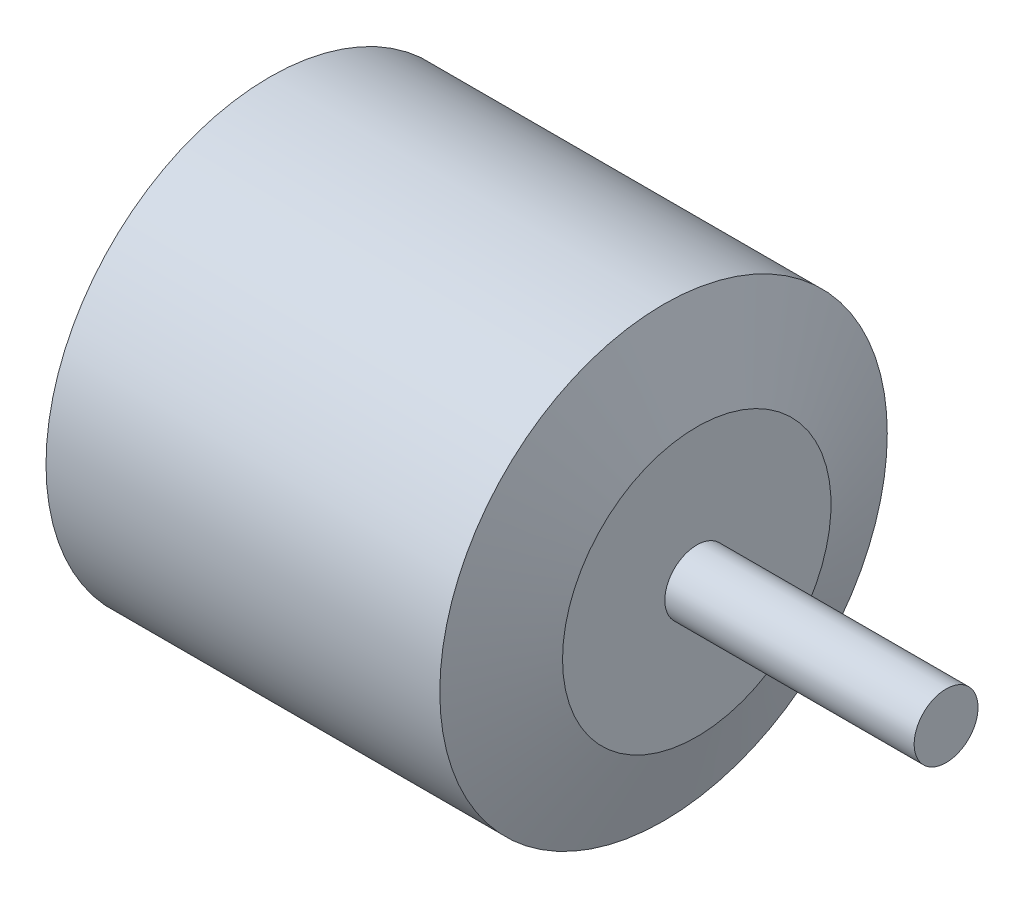
ISO-10303-21;
HEADER;
FILE_DESCRIPTION(('STEP AP214'),'2;1');
FILE_NAME('part.step','',(''),(''),'','','');
FILE_SCHEMA(('AUTOMOTIVE_DESIGN { 1 0 10303 214 1 1 1 1 }'));
ENDSEC;
DATA;
#1=APPLICATION_CONTEXT('core data for automotive mechanical design processes');
#2=APPLICATION_PROTOCOL_DEFINITION('international standard','automotive_design',2000,#1);
#3=PRODUCT_CONTEXT('',#1,'mechanical');
#4=PRODUCT('Part','Part','',(#3));
#5=PRODUCT_RELATED_PRODUCT_CATEGORY('part','',(#4));
#6=PRODUCT_DEFINITION_FORMATION('','',#4);
#7=PRODUCT_DEFINITION_CONTEXT('part definition',#1,'design');
#8=PRODUCT_DEFINITION('design','',#6,#7);
#9=PRODUCT_DEFINITION_SHAPE('','',#8);
#10=(LENGTH_UNIT() NAMED_UNIT(*) SI_UNIT(.MILLI.,.METRE.));
#11=(NAMED_UNIT(*) PLANE_ANGLE_UNIT() SI_UNIT($,.RADIAN.));
#12=(NAMED_UNIT(*) SI_UNIT($,.STERADIAN.) SOLID_ANGLE_UNIT());
#13=UNCERTAINTY_MEASURE_WITH_UNIT(LENGTH_MEASURE(1.E-05),#10,'distance_accuracy_value','');
#14=(GEOMETRIC_REPRESENTATION_CONTEXT(3) GLOBAL_UNCERTAINTY_ASSIGNED_CONTEXT((#13)) GLOBAL_UNIT_ASSIGNED_CONTEXT((#10,
#11,#12)) REPRESENTATION_CONTEXT('',''));
#15=CARTESIAN_POINT('',(0.,0.,0.));
#16=DIRECTION('',(0.,0.,1.));
#17=DIRECTION('',(1.,0.,0.));
#18=AXIS2_PLACEMENT_3D('',#15,#16,#17);
#19=CARTESIAN_POINT('',(0.,0.,0.));
#20=DIRECTION('',(-1.,0.,0.));
#21=DIRECTION('',(0.,0.,1.));
#22=AXIS2_PLACEMENT_3D('',#19,#20,#21);
#23=PLANE('',#22);
#24=CARTESIAN_POINT('',(0.,0.,0.));
#25=DIRECTION('',(-1.,0.,0.));
#26=DIRECTION('',(0.,0.,1.));
#27=AXIS2_PLACEMENT_3D('',#24,#25,#26);
#28=CIRCLE('',#27,2.5);
#29=CARTESIAN_POINT('',(0.,0.,2.5));
#30=VERTEX_POINT('',#29);
#31=EDGE_CURVE('E10',#30,#30,#28,.T.);
#32=ORIENTED_EDGE('',*,*,#31,.F.);
#33=EDGE_LOOP('',(#32));
#34=FACE_BOUND('',#33,.T.);
#35=ADVANCED_FACE('F30',(#34),#23,.F.);
#36=CARTESIAN_POINT('',(-58.,0.,0.));
#37=DIRECTION('',(-1.,0.,0.));
#38=DIRECTION('',(0.,0.,1.));
#39=AXIS2_PLACEMENT_3D('',#36,#37,#38);
#40=CYLINDRICAL_SURFACE('',#39,2.5);
#41=CARTESIAN_POINT('',(-19.5,0.,0.));
#42=DIRECTION('',(-1.,0.,0.));
#43=DIRECTION('',(0.,0.,1.));
#44=AXIS2_PLACEMENT_3D('',#41,#42,#43);
#45=CIRCLE('',#44,2.5);
#46=CARTESIAN_POINT('',(-19.5,0.,2.5));
#47=VERTEX_POINT('',#46);
#48=EDGE_CURVE('E36',#47,#47,#45,.T.);
#49=ORIENTED_EDGE('',*,*,#48,.F.);
#50=EDGE_LOOP('',(#49));
#51=FACE_BOUND('',#50,.T.);
#52=ORIENTED_EDGE('',*,*,#31,.T.);
#53=EDGE_LOOP('',(#52));
#54=FACE_BOUND('',#53,.T.);
#55=ADVANCED_FACE('F96',(#51,#54),#40,.T.);
#56=CARTESIAN_POINT('',(-19.5,2.5,0.));
#57=DIRECTION('',(-1.,0.,0.));
#58=DIRECTION('',(0.,0.,1.));
#59=AXIS2_PLACEMENT_3D('',#56,#57,#58);
#60=PLANE('',#59);
#61=CARTESIAN_POINT('',(-19.5,0.,0.));
#62=DIRECTION('',(-1.,0.,0.));
#63=DIRECTION('',(0.,0.,1.));
#64=AXIS2_PLACEMENT_3D('',#61,#62,#63);
#65=CIRCLE('',#64,10.5);
#66=CARTESIAN_POINT('',(-19.5,0.,10.5));
#67=VERTEX_POINT('',#66);
#68=EDGE_CURVE('E40',#67,#67,#65,.T.);
#69=ORIENTED_EDGE('',*,*,#68,.F.);
#70=EDGE_LOOP('',(#69));
#71=FACE_BOUND('',#70,.T.);
#72=ORIENTED_EDGE('',*,*,#48,.T.);
#73=EDGE_LOOP('',(#72));
#74=FACE_BOUND('',#73,.T.);
#75=ADVANCED_FACE('F91',(#71,#74),#60,.F.);
#76=CARTESIAN_POINT('',(-19.5,0.,0.));
#77=DIRECTION('',(-1.,0.,0.));
#78=DIRECTION('',(0.,0.,1.));
#79=AXIS2_PLACEMENT_3D('',#76,#77,#78);
#80=CONICAL_SURFACE('',#79,10.5,1.21516044249414);
#81=CARTESIAN_POINT('',(-22.1,0.,0.));
#82=DIRECTION('',(-1.,0.,0.));
#83=DIRECTION('',(0.,0.,1.));
#84=AXIS2_PLACEMENT_3D('',#81,#82,#83);
#85=CIRCLE('',#84,17.5);
#86=CARTESIAN_POINT('',(-22.1,0.,17.5));
#87=VERTEX_POINT('',#86);
#88=EDGE_CURVE('E44',#87,#87,#85,.T.);
#89=ORIENTED_EDGE('',*,*,#88,.F.);
#90=EDGE_LOOP('',(#89));
#91=FACE_BOUND('',#90,.T.);
#92=ORIENTED_EDGE('',*,*,#68,.T.);
#93=EDGE_LOOP('',(#92));
#94=FACE_BOUND('',#93,.T.);
#95=ADVANCED_FACE('F85',(#91,#94),#80,.T.);
#96=CARTESIAN_POINT('',(-58.,0.,0.));
#97=DIRECTION('',(-1.,0.,0.));
#98=DIRECTION('',(0.,0.,1.));
#99=AXIS2_PLACEMENT_3D('',#96,#97,#98);
#100=CYLINDRICAL_SURFACE('',#99,17.5);
#101=CARTESIAN_POINT('',(-52.9,0.,0.));
#102=DIRECTION('',(-1.,0.,0.));
#103=DIRECTION('',(0.,0.,1.));
#104=AXIS2_PLACEMENT_3D('',#101,#102,#103);
#105=CIRCLE('',#104,17.5);
#106=CARTESIAN_POINT('',(-52.9,0.,17.5));
#107=VERTEX_POINT('',#106);
#108=EDGE_CURVE('E49',#107,#107,#105,.T.);
#109=ORIENTED_EDGE('',*,*,#108,.F.);
#110=EDGE_LOOP('',(#109));
#111=FACE_BOUND('',#110,.T.);
#112=ORIENTED_EDGE('',*,*,#88,.T.);
#113=EDGE_LOOP('',(#112));
#114=FACE_BOUND('',#113,.T.);
#115=ADVANCED_FACE('F79',(#111,#114),#100,.T.);
#116=CARTESIAN_POINT('',(-52.9,0.,0.));
#117=DIRECTION('',(1.,0.,0.));
#118=DIRECTION('',(0.,0.,-1.));
#119=AXIS2_PLACEMENT_3D('',#116,#117,#118);
#120=CONICAL_SURFACE('',#119,17.5,1.21516044249414);
#121=CARTESIAN_POINT('',(-55.5,0.,0.));
#122=DIRECTION('',(-1.,0.,0.));
#123=DIRECTION('',(0.,0.,1.));
#124=AXIS2_PLACEMENT_3D('',#121,#122,#123);
#125=CIRCLE('',#124,10.5);
#126=CARTESIAN_POINT('',(-55.5,0.,10.5));
#127=VERTEX_POINT('',#126);
#128=EDGE_CURVE('E52',#127,#127,#125,.T.);
#129=ORIENTED_EDGE('',*,*,#128,.F.);
#130=EDGE_LOOP('',(#129));
#131=FACE_BOUND('',#130,.T.);
#132=ORIENTED_EDGE('',*,*,#108,.T.);
#133=EDGE_LOOP('',(#132));
#134=FACE_BOUND('',#133,.T.);
#135=ADVANCED_FACE('F73',(#131,#134),#120,.T.);
#136=CARTESIAN_POINT('',(-55.5,10.5,0.));
#137=DIRECTION('',(1.,0.,0.));
#138=DIRECTION('',(0.,0.,-1.));
#139=AXIS2_PLACEMENT_3D('',#136,#137,#138);
#140=PLANE('',#139);
#141=CARTESIAN_POINT('',(-55.5,0.,0.));
#142=DIRECTION('',(-1.,0.,0.));
#143=DIRECTION('',(0.,0.,1.));
#144=AXIS2_PLACEMENT_3D('',#141,#142,#143);
#145=CIRCLE('',#144,5.5);
#146=CARTESIAN_POINT('',(-55.5,0.,5.5));
#147=VERTEX_POINT('',#146);
#148=EDGE_CURVE('E55',#147,#147,#145,.T.);
#149=ORIENTED_EDGE('',*,*,#148,.F.);
#150=EDGE_LOOP('',(#149));
#151=FACE_BOUND('',#150,.T.);
#152=ORIENTED_EDGE('',*,*,#128,.T.);
#153=EDGE_LOOP('',(#152));
#154=FACE_BOUND('',#153,.T.);
#155=ADVANCED_FACE('F67',(#151,#154),#140,.F.);
#156=CARTESIAN_POINT('',(-58.,0.,0.));
#157=DIRECTION('',(-1.,0.,0.));
#158=DIRECTION('',(0.,0.,1.));
#159=AXIS2_PLACEMENT_3D('',#156,#157,#158);
#160=CYLINDRICAL_SURFACE('',#159,5.5);
#161=CARTESIAN_POINT('',(-58.,0.,0.));
#162=DIRECTION('',(-1.,0.,0.));
#163=DIRECTION('',(0.,0.,1.));
#164=AXIS2_PLACEMENT_3D('',#161,#162,#163);
#165=CIRCLE('',#164,5.5);
#166=CARTESIAN_POINT('',(-58.,0.,5.5));
#167=VERTEX_POINT('',#166);
#168=EDGE_CURVE('E58',#167,#167,#165,.T.);
#169=ORIENTED_EDGE('',*,*,#168,.F.);
#170=EDGE_LOOP('',(#169));
#171=FACE_BOUND('',#170,.T.);
#172=ORIENTED_EDGE('',*,*,#148,.T.);
#173=EDGE_LOOP('',(#172));
#174=FACE_BOUND('',#173,.T.);
#175=ADVANCED_FACE('F64',(#171,#174),#160,.T.);
#176=CARTESIAN_POINT('',(-58.,5.5,0.));
#177=DIRECTION('',(1.,0.,0.));
#178=DIRECTION('',(0.,0.,-1.));
#179=AXIS2_PLACEMENT_3D('',#176,#177,#178);
#180=PLANE('',#179);
#181=ORIENTED_EDGE('',*,*,#168,.T.);
#182=EDGE_LOOP('',(#181));
#183=FACE_BOUND('',#182,.T.);
#184=ADVANCED_FACE('F62',(#183),#180,.F.);
#185=CLOSED_SHELL('',(#35,#55,#75,#95,#115,#135,#155,#175,#184));
#186=MANIFOLD_SOLID_BREP('B2',#185);
#187=ADVANCED_BREP_SHAPE_REPRESENTATION('',(#18,#186),#14);
#188=SHAPE_DEFINITION_REPRESENTATION(#9,#187);
ENDSEC;
END-ISO-10303-21;
